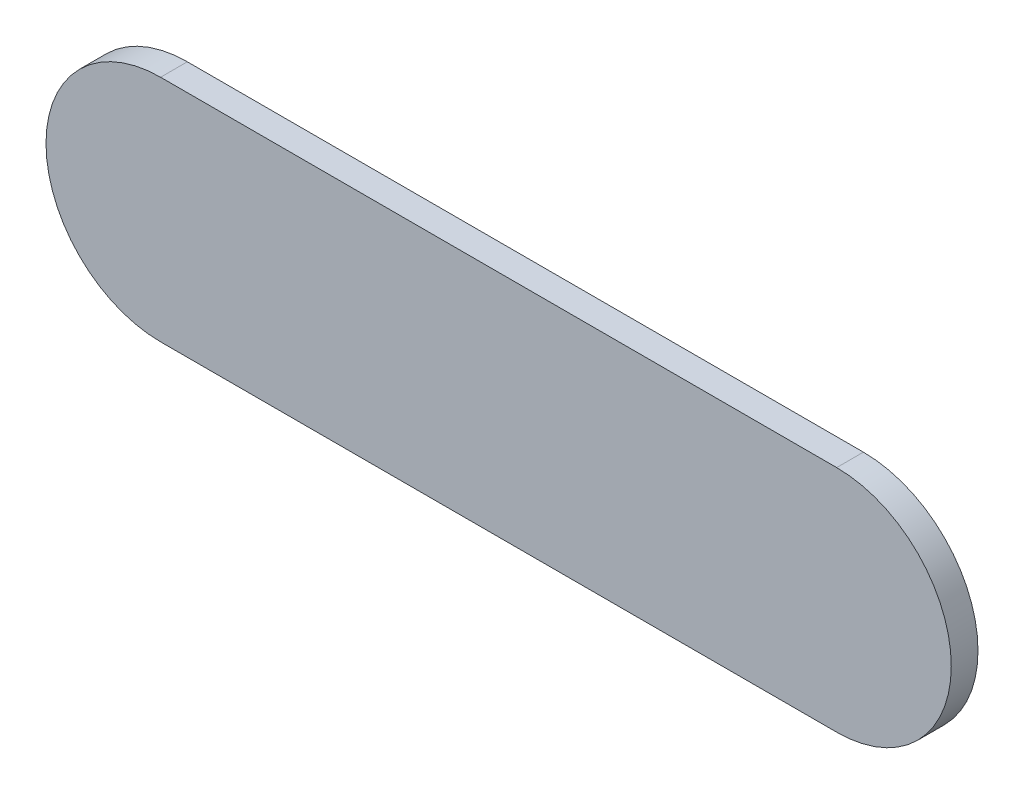
ISO-10303-21;
HEADER;
FILE_DESCRIPTION(('STEP AP214'),'2;1');
FILE_NAME('part.step','',(''),(''),'','','');
FILE_SCHEMA(('AUTOMOTIVE_DESIGN { 1 0 10303 214 1 1 1 1 }'));
ENDSEC;
DATA;
#1=APPLICATION_CONTEXT('core data for automotive mechanical design processes');
#2=APPLICATION_PROTOCOL_DEFINITION('international standard','automotive_design',2000,#1);
#3=PRODUCT_CONTEXT('',#1,'mechanical');
#4=PRODUCT('Part','Part','',(#3));
#5=PRODUCT_RELATED_PRODUCT_CATEGORY('part','',(#4));
#6=PRODUCT_DEFINITION_FORMATION('','',#4);
#7=PRODUCT_DEFINITION_CONTEXT('part definition',#1,'design');
#8=PRODUCT_DEFINITION('design','',#6,#7);
#9=PRODUCT_DEFINITION_SHAPE('','',#8);
#10=(LENGTH_UNIT() NAMED_UNIT(*) SI_UNIT(.MILLI.,.METRE.));
#11=(NAMED_UNIT(*) PLANE_ANGLE_UNIT() SI_UNIT($,.RADIAN.));
#12=(NAMED_UNIT(*) SI_UNIT($,.STERADIAN.) SOLID_ANGLE_UNIT());
#13=UNCERTAINTY_MEASURE_WITH_UNIT(LENGTH_MEASURE(1.E-05),#10,'distance_accuracy_value','');
#14=(GEOMETRIC_REPRESENTATION_CONTEXT(3) GLOBAL_UNCERTAINTY_ASSIGNED_CONTEXT((#13)) GLOBAL_UNIT_ASSIGNED_CONTEXT((#10,
#11,#12)) REPRESENTATION_CONTEXT('',''));
#15=CARTESIAN_POINT('',(0.,0.,0.));
#16=DIRECTION('',(0.,0.,1.));
#17=DIRECTION('',(1.,0.,0.));
#18=AXIS2_PLACEMENT_3D('',#15,#16,#17);
#19=CARTESIAN_POINT('',(90.43,-72.69,1.635));
#20=DIRECTION('',(0.,0.,1.));
#21=DIRECTION('',(1.,0.,0.));
#22=AXIS2_PLACEMENT_3D('',#19,#20,#21);
#23=PLANE('',#22);
#24=DIRECTION('',(-1.,0.,0.));
#25=VECTOR('',#24,1.);
#26=CARTESIAN_POINT('',(90.43,-72.69,1.635));
#27=LINE('',#26,#25);
#28=CARTESIAN_POINT('',(90.43,-72.69,1.635));
#29=VERTEX_POINT('',#28);
#30=CARTESIAN_POINT('',(89.545,-72.69,1.635));
#31=VERTEX_POINT('',#30);
#32=EDGE_CURVE('E81',#29,#31,#27,.T.);
#33=ORIENTED_EDGE('',*,*,#32,.T.);
#34=CARTESIAN_POINT('',(89.545,-72.84,1.635));
#35=DIRECTION('',(0.,0.,1.));
#36=DIRECTION('',(0.,1.,0.));
#37=AXIS2_PLACEMENT_3D('',#34,#35,#36);
#38=CIRCLE('',#37,0.15);
#39=CARTESIAN_POINT('',(89.545,-72.99,1.635));
#40=VERTEX_POINT('',#39);
#41=EDGE_CURVE('E99',#31,#40,#38,.T.);
#42=ORIENTED_EDGE('',*,*,#41,.T.);
#43=DIRECTION('',(1.,0.,0.));
#44=VECTOR('',#43,1.);
#45=CARTESIAN_POINT('',(89.545,-72.99,1.635));
#46=LINE('',#45,#44);
#47=CARTESIAN_POINT('',(90.43,-72.99,1.635));
#48=VERTEX_POINT('',#47);
#49=EDGE_CURVE('E74',#40,#48,#46,.T.);
#50=ORIENTED_EDGE('',*,*,#49,.T.);
#51=CARTESIAN_POINT('',(90.43,-72.84,1.635));
#52=DIRECTION('',(0.,0.,1.));
#53=DIRECTION('',(0.,-1.,0.));
#54=AXIS2_PLACEMENT_3D('',#51,#52,#53);
#55=CIRCLE('',#54,0.15);
#56=EDGE_CURVE('E11',#48,#29,#55,.T.);
#57=ORIENTED_EDGE('',*,*,#56,.T.);
#58=EDGE_LOOP('',(#33,#42,#50,#57));
#59=FACE_BOUND('',#58,.T.);
#60=ADVANCED_FACE('F17',(#59),#23,.T.);
#61=CARTESIAN_POINT('',(90.43,-72.69,1.6));
#62=DIRECTION('',(0.,0.,1.));
#63=DIRECTION('',(1.,0.,0.));
#64=AXIS2_PLACEMENT_3D('',#61,#62,#63);
#65=PLANE('',#64);
#66=CARTESIAN_POINT('',(90.43,-72.84,1.6));
#67=DIRECTION('',(0.,0.,1.));
#68=DIRECTION('',(0.,-1.,0.));
#69=AXIS2_PLACEMENT_3D('',#66,#67,#68);
#70=CIRCLE('',#69,0.15);
#71=CARTESIAN_POINT('',(90.43,-72.99,1.6));
#72=VERTEX_POINT('',#71);
#73=CARTESIAN_POINT('',(90.43,-72.69,1.6));
#74=VERTEX_POINT('',#73);
#75=EDGE_CURVE('E25',#72,#74,#70,.T.);
#76=ORIENTED_EDGE('',*,*,#75,.F.);
#77=DIRECTION('',(1.,0.,0.));
#78=VECTOR('',#77,1.);
#79=CARTESIAN_POINT('',(89.545,-72.99,1.6));
#80=LINE('',#79,#78);
#81=CARTESIAN_POINT('',(89.545,-72.99,1.6));
#82=VERTEX_POINT('',#81);
#83=EDGE_CURVE('E97',#82,#72,#80,.T.);
#84=ORIENTED_EDGE('',*,*,#83,.F.);
#85=CARTESIAN_POINT('',(89.545,-72.84,1.6));
#86=DIRECTION('',(0.,0.,1.));
#87=DIRECTION('',(0.,1.,0.));
#88=AXIS2_PLACEMENT_3D('',#85,#86,#87);
#89=CIRCLE('',#88,0.15);
#90=CARTESIAN_POINT('',(89.545,-72.69,1.6));
#91=VERTEX_POINT('',#90);
#92=EDGE_CURVE('E83',#91,#82,#89,.T.);
#93=ORIENTED_EDGE('',*,*,#92,.F.);
#94=DIRECTION('',(-1.,0.,0.));
#95=VECTOR('',#94,1.);
#96=CARTESIAN_POINT('',(90.43,-72.69,1.6));
#97=LINE('',#96,#95);
#98=EDGE_CURVE('E79',#74,#91,#97,.T.);
#99=ORIENTED_EDGE('',*,*,#98,.F.);
#100=EDGE_LOOP('',(#76,#84,#93,#99));
#101=FACE_BOUND('',#100,.T.);
#102=ADVANCED_FACE('F85',(#101),#65,.F.);
#103=CARTESIAN_POINT('',(90.43,-72.84,1.6));
#104=DIRECTION('',(0.,0.,-1.));
#105=DIRECTION('',(0.,-1.,0.));
#106=AXIS2_PLACEMENT_3D('',#103,#104,#105);
#107=CYLINDRICAL_SURFACE('',#106,0.15);
#108=ORIENTED_EDGE('',*,*,#75,.T.);
#109=DIRECTION('',(0.,0.,1.));
#110=VECTOR('',#109,1.);
#111=CARTESIAN_POINT('',(90.43,-72.69,1.6));
#112=LINE('',#111,#110);
#113=EDGE_CURVE('E68',#74,#29,#112,.T.);
#114=ORIENTED_EDGE('',*,*,#113,.T.);
#115=ORIENTED_EDGE('',*,*,#56,.F.);
#116=DIRECTION('',(0.,0.,1.));
#117=VECTOR('',#116,1.);
#118=CARTESIAN_POINT('',(90.43,-72.99,1.6));
#119=LINE('',#118,#117);
#120=EDGE_CURVE('E71',#72,#48,#119,.T.);
#121=ORIENTED_EDGE('',*,*,#120,.F.);
#122=EDGE_LOOP('',(#108,#114,#115,#121));
#123=FACE_BOUND('',#122,.T.);
#124=ADVANCED_FACE('F67',(#123),#107,.T.);
#125=CARTESIAN_POINT('',(89.545,-72.99,1.6));
#126=DIRECTION('',(0.,1.,0.));
#127=DIRECTION('',(1.,0.,0.));
#128=AXIS2_PLACEMENT_3D('',#125,#126,#127);
#129=PLANE('',#128);
#130=ORIENTED_EDGE('',*,*,#83,.T.);
#131=ORIENTED_EDGE('',*,*,#120,.T.);
#132=ORIENTED_EDGE('',*,*,#49,.F.);
#133=DIRECTION('',(0.,0.,1.));
#134=VECTOR('',#133,1.);
#135=CARTESIAN_POINT('',(89.545,-72.99,1.6));
#136=LINE('',#135,#134);
#137=EDGE_CURVE('E105',#82,#40,#136,.T.);
#138=ORIENTED_EDGE('',*,*,#137,.F.);
#139=EDGE_LOOP('',(#130,#131,#132,#138));
#140=FACE_BOUND('',#139,.T.);
#141=ADVANCED_FACE('F118',(#140),#129,.F.);
#142=CARTESIAN_POINT('',(89.545,-72.84,1.6));
#143=DIRECTION('',(0.,0.,-1.));
#144=DIRECTION('',(0.,1.,0.));
#145=AXIS2_PLACEMENT_3D('',#142,#143,#144);
#146=CYLINDRICAL_SURFACE('',#145,0.15);
#147=ORIENTED_EDGE('',*,*,#92,.T.);
#148=ORIENTED_EDGE('',*,*,#137,.T.);
#149=ORIENTED_EDGE('',*,*,#41,.F.);
#150=DIRECTION('',(0.,0.,1.));
#151=VECTOR('',#150,1.);
#152=CARTESIAN_POINT('',(89.545,-72.69,1.6));
#153=LINE('',#152,#151);
#154=EDGE_CURVE('E89',#91,#31,#153,.T.);
#155=ORIENTED_EDGE('',*,*,#154,.F.);
#156=EDGE_LOOP('',(#147,#148,#149,#155));
#157=FACE_BOUND('',#156,.T.);
#158=ADVANCED_FACE('F121',(#157),#146,.T.);
#159=CARTESIAN_POINT('',(90.43,-72.69,1.6));
#160=DIRECTION('',(0.,-1.,0.));
#161=DIRECTION('',(0.,0.,-1.));
#162=AXIS2_PLACEMENT_3D('',#159,#160,#161);
#163=PLANE('',#162);
#164=ORIENTED_EDGE('',*,*,#98,.T.);
#165=ORIENTED_EDGE('',*,*,#154,.T.);
#166=ORIENTED_EDGE('',*,*,#32,.F.);
#167=ORIENTED_EDGE('',*,*,#113,.F.);
#168=EDGE_LOOP('',(#164,#165,#166,#167));
#169=FACE_BOUND('',#168,.T.);
#170=ADVANCED_FACE('F77',(#169),#163,.F.);
#171=CLOSED_SHELL('',(#60,#102,#124,#141,#158,#170));
#172=MANIFOLD_SOLID_BREP('B1',#171);
#173=ADVANCED_BREP_SHAPE_REPRESENTATION('',(#18,#172),#14);
#174=SHAPE_DEFINITION_REPRESENTATION(#9,#173);
ENDSEC;
END-ISO-10303-21;
